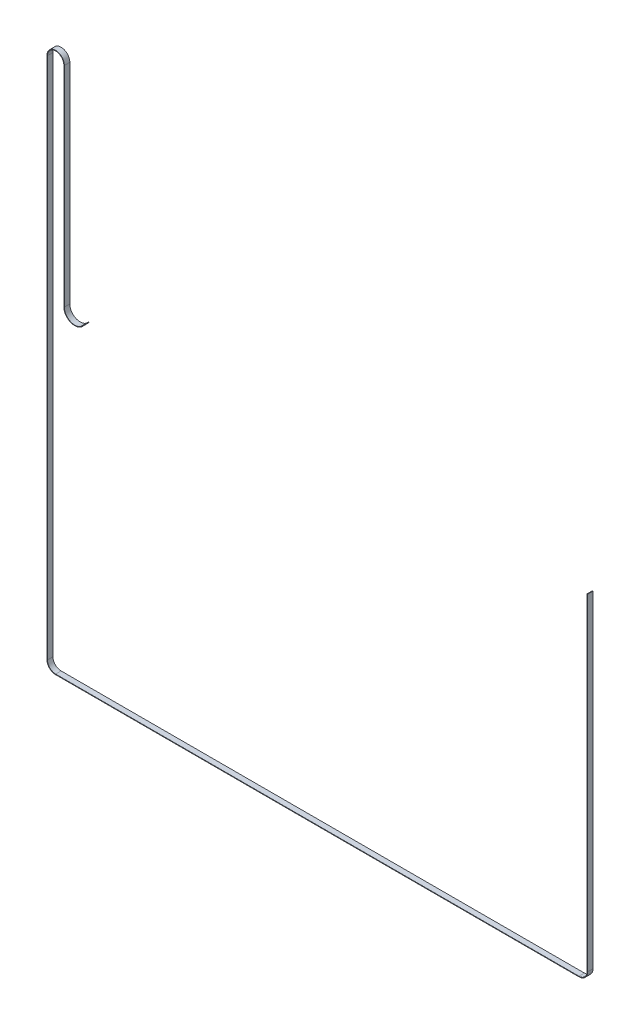
ISO-10303-21;
HEADER;
FILE_DESCRIPTION(('STEP AP214'),'2;1');
FILE_NAME('part.step','',(''),(''),'','','');
FILE_SCHEMA(('AUTOMOTIVE_DESIGN { 1 0 10303 214 1 1 1 1 }'));
ENDSEC;
DATA;
#1=APPLICATION_CONTEXT('core data for automotive mechanical design processes');
#2=APPLICATION_PROTOCOL_DEFINITION('international standard','automotive_design',2000,#1);
#3=PRODUCT_CONTEXT('',#1,'mechanical');
#4=PRODUCT('Part','Part','',(#3));
#5=PRODUCT_RELATED_PRODUCT_CATEGORY('part','',(#4));
#6=PRODUCT_DEFINITION_FORMATION('','',#4);
#7=PRODUCT_DEFINITION_CONTEXT('part definition',#1,'design');
#8=PRODUCT_DEFINITION('design','',#6,#7);
#9=PRODUCT_DEFINITION_SHAPE('','',#8);
#10=(LENGTH_UNIT() NAMED_UNIT(*) SI_UNIT(.MILLI.,.METRE.));
#11=(NAMED_UNIT(*) PLANE_ANGLE_UNIT() SI_UNIT($,.RADIAN.));
#12=(NAMED_UNIT(*) SI_UNIT($,.STERADIAN.) SOLID_ANGLE_UNIT());
#13=UNCERTAINTY_MEASURE_WITH_UNIT(LENGTH_MEASURE(1.E-05),#10,'distance_accuracy_value','');
#14=(GEOMETRIC_REPRESENTATION_CONTEXT(3) GLOBAL_UNCERTAINTY_ASSIGNED_CONTEXT((#13)) GLOBAL_UNIT_ASSIGNED_CONTEXT((#10,
#11,#12)) REPRESENTATION_CONTEXT('',''));
#15=CARTESIAN_POINT('',(0.,0.,0.));
#16=DIRECTION('',(0.,0.,1.));
#17=DIRECTION('',(1.,0.,0.));
#18=AXIS2_PLACEMENT_3D('',#15,#16,#17);
#19=CARTESIAN_POINT('',(-222.5,288.,2.5));
#20=DIRECTION('',(0.,0.,-1.));
#21=DIRECTION('',(-1.,0.,0.));
#22=AXIS2_PLACEMENT_3D('',#19,#20,#21);
#23=CYLINDRICAL_SURFACE('',#22,9.99999999999962);
#24=CARTESIAN_POINT('',(-222.5,288.,-2.5));
#25=DIRECTION('',(0.,0.,1.));
#26=DIRECTION('',(1.,0.,0.));
#27=AXIS2_PLACEMENT_3D('',#24,#25,#26);
#28=CIRCLE('',#27,9.99999999999962);
#29=CARTESIAN_POINT('',(-232.5,288.,-2.5));
#30=VERTEX_POINT('',#29);
#31=CARTESIAN_POINT('',(-214.437599566757,282.084114668621,-2.5));
#32=VERTEX_POINT('',#31);
#33=EDGE_CURVE('E188',#30,#32,#28,.T.);
#34=ORIENTED_EDGE('',*,*,#33,.T.);
#35=DIRECTION('',(0.,0.,-1.));
#36=VECTOR('',#35,1.);
#37=CARTESIAN_POINT('',(-214.437599566757,282.084114668621,2.5));
#38=LINE('',#37,#36);
#39=CARTESIAN_POINT('',(-214.437599566757,282.084114668621,2.5));
#40=VERTEX_POINT('',#39);
#41=EDGE_CURVE('E11',#40,#32,#38,.T.);
#42=ORIENTED_EDGE('',*,*,#41,.F.);
#43=CARTESIAN_POINT('',(-222.5,288.,2.5));
#44=DIRECTION('',(0.,0.,1.));
#45=DIRECTION('',(1.,0.,0.));
#46=AXIS2_PLACEMENT_3D('',#43,#44,#45);
#47=CIRCLE('',#46,9.99999999999962);
#48=CARTESIAN_POINT('',(-232.5,288.,2.5));
#49=VERTEX_POINT('',#48);
#50=EDGE_CURVE('E119',#49,#40,#47,.T.);
#51=ORIENTED_EDGE('',*,*,#50,.F.);
#52=DIRECTION('',(0.,0.,-1.));
#53=VECTOR('',#52,1.);
#54=CARTESIAN_POINT('',(-232.5,288.,2.5));
#55=LINE('',#54,#53);
#56=EDGE_CURVE('E184',#49,#30,#55,.T.);
#57=ORIENTED_EDGE('',*,*,#56,.T.);
#58=EDGE_LOOP('',(#34,#42,#51,#57));
#59=FACE_BOUND('',#58,.T.);
#60=ADVANCED_FACE('F33',(#59),#23,.T.);
#61=CARTESIAN_POINT('',(-214.840719588419,282.37990893519,2.5));
#62=DIRECTION('',(0.591588533137898,0.806240043324412,0.));
#63=DIRECTION('',(-0.806240043324412,0.591588533137898,0.));
#64=AXIS2_PLACEMENT_3D('',#61,#62,#63);
#65=PLANE('',#64);
#66=DIRECTION('',(0.806240043324412,-0.591588533137898,0.));
#67=VECTOR('',#66,1.);
#68=CARTESIAN_POINT('',(-214.840719588419,282.37990893519,-2.5));
#69=LINE('',#68,#67);
#70=CARTESIAN_POINT('',(-214.840719588419,282.37990893519,-2.5));
#71=VERTEX_POINT('',#70);
#72=EDGE_CURVE('E191',#71,#32,#69,.T.);
#73=ORIENTED_EDGE('',*,*,#72,.F.);
#74=DIRECTION('',(0.,0.,-1.));
#75=VECTOR('',#74,1.);
#76=CARTESIAN_POINT('',(-214.840719588419,282.37990893519,2.5));
#77=LINE('',#76,#75);
#78=CARTESIAN_POINT('',(-214.840719588419,282.37990893519,2.5));
#79=VERTEX_POINT('',#78);
#80=EDGE_CURVE('E41',#79,#71,#77,.T.);
#81=ORIENTED_EDGE('',*,*,#80,.F.);
#82=DIRECTION('',(0.806240043324412,-0.591588533137898,0.));
#83=VECTOR('',#82,1.);
#84=CARTESIAN_POINT('',(-214.840719588419,282.37990893519,2.5));
#85=LINE('',#84,#83);
#86=EDGE_CURVE('E283',#79,#40,#85,.T.);
#87=ORIENTED_EDGE('',*,*,#86,.T.);
#88=ORIENTED_EDGE('',*,*,#41,.T.);
#89=EDGE_LOOP('',(#73,#81,#87,#88));
#90=FACE_BOUND('',#89,.T.);
#91=ADVANCED_FACE('F270',(#90),#65,.T.);
#92=CARTESIAN_POINT('',(-222.5,288.,2.5));
#93=DIRECTION('',(0.,0.,-1.));
#94=DIRECTION('',(-1.,0.,0.));
#95=AXIS2_PLACEMENT_3D('',#92,#93,#94);
#96=CYLINDRICAL_SURFACE('',#95,9.49999999999962);
#97=CARTESIAN_POINT('',(-222.5,288.,-2.5));
#98=DIRECTION('',(0.,0.,1.));
#99=DIRECTION('',(1.,0.,0.));
#100=AXIS2_PLACEMENT_3D('',#97,#98,#99);
#101=CIRCLE('',#100,9.49999999999962);
#102=CARTESIAN_POINT('',(-232.,288.,-2.5));
#103=VERTEX_POINT('',#102);
#104=EDGE_CURVE('E194',#103,#71,#101,.T.);
#105=ORIENTED_EDGE('',*,*,#104,.F.);
#106=DIRECTION('',(0.,0.,-1.));
#107=VECTOR('',#106,1.);
#108=CARTESIAN_POINT('',(-232.,288.,2.5));
#109=LINE('',#108,#107);
#110=CARTESIAN_POINT('',(-232.,288.,2.5));
#111=VERTEX_POINT('',#110);
#112=EDGE_CURVE('E260',#111,#103,#109,.T.);
#113=ORIENTED_EDGE('',*,*,#112,.F.);
#114=CARTESIAN_POINT('',(-222.5,288.,2.5));
#115=DIRECTION('',(0.,0.,1.));
#116=DIRECTION('',(1.,0.,0.));
#117=AXIS2_PLACEMENT_3D('',#114,#115,#116);
#118=CIRCLE('',#117,9.49999999999962);
#119=EDGE_CURVE('E267',#111,#79,#118,.T.);
#120=ORIENTED_EDGE('',*,*,#119,.T.);
#121=ORIENTED_EDGE('',*,*,#80,.T.);
#122=EDGE_LOOP('',(#105,#113,#120,#121));
#123=FACE_BOUND('',#122,.T.);
#124=ADVANCED_FACE('F265',(#123),#96,.F.);
#125=CARTESIAN_POINT('',(-232.,480.,2.5));
#126=DIRECTION('',(1.,0.,0.));
#127=DIRECTION('',(0.,1.,0.));
#128=AXIS2_PLACEMENT_3D('',#125,#126,#127);
#129=PLANE('',#128);
#130=DIRECTION('',(0.,-1.,0.));
#131=VECTOR('',#130,1.);
#132=CARTESIAN_POINT('',(-232.,480.,-2.5));
#133=LINE('',#132,#131);
#134=CARTESIAN_POINT('',(-232.,480.,-2.5));
#135=VERTEX_POINT('',#134);
#136=EDGE_CURVE('E197',#135,#103,#133,.T.);
#137=ORIENTED_EDGE('',*,*,#136,.F.);
#138=DIRECTION('',(0.,0.,-1.));
#139=VECTOR('',#138,1.);
#140=CARTESIAN_POINT('',(-232.,480.,2.5));
#141=LINE('',#140,#139);
#142=CARTESIAN_POINT('',(-232.,480.,2.5));
#143=VERTEX_POINT('',#142);
#144=EDGE_CURVE('E258',#143,#135,#141,.T.);
#145=ORIENTED_EDGE('',*,*,#144,.F.);
#146=DIRECTION('',(0.,-1.,0.));
#147=VECTOR('',#146,1.);
#148=CARTESIAN_POINT('',(-232.,480.,2.5));
#149=LINE('',#148,#147);
#150=EDGE_CURVE('E280',#143,#111,#149,.T.);
#151=ORIENTED_EDGE('',*,*,#150,.T.);
#152=ORIENTED_EDGE('',*,*,#112,.T.);
#153=EDGE_LOOP('',(#137,#145,#151,#152));
#154=FACE_BOUND('',#153,.T.);
#155=ADVANCED_FACE('F277',(#154),#129,.T.);
#156=CARTESIAN_POINT('',(-240.,480.,2.5));
#157=DIRECTION('',(0.,0.,-1.));
#158=DIRECTION('',(-1.,0.,0.));
#159=AXIS2_PLACEMENT_3D('',#156,#157,#158);
#160=CYLINDRICAL_SURFACE('',#159,8.00000000000001);
#161=CARTESIAN_POINT('',(-240.,480.,-2.5));
#162=DIRECTION('',(0.,0.,1.));
#163=DIRECTION('',(1.,0.,0.));
#164=AXIS2_PLACEMENT_3D('',#161,#162,#163);
#165=CIRCLE('',#164,8.00000000000001);
#166=CARTESIAN_POINT('',(-248.,480.,-2.5));
#167=VERTEX_POINT('',#166);
#168=EDGE_CURVE('E200',#167,#135,#165,.F.);
#169=ORIENTED_EDGE('',*,*,#168,.F.);
#170=DIRECTION('',(0.,0.,-1.));
#171=VECTOR('',#170,1.);
#172=CARTESIAN_POINT('',(-248.,480.,2.5));
#173=LINE('',#172,#171);
#174=CARTESIAN_POINT('',(-248.,480.,2.5));
#175=VERTEX_POINT('',#174);
#176=EDGE_CURVE('E256',#175,#167,#173,.T.);
#177=ORIENTED_EDGE('',*,*,#176,.F.);
#178=CARTESIAN_POINT('',(-240.,480.,2.5));
#179=DIRECTION('',(0.,0.,1.));
#180=DIRECTION('',(1.,0.,0.));
#181=AXIS2_PLACEMENT_3D('',#178,#179,#180);
#182=CIRCLE('',#181,8.00000000000001);
#183=EDGE_CURVE('E285',#175,#143,#182,.F.);
#184=ORIENTED_EDGE('',*,*,#183,.T.);
#185=ORIENTED_EDGE('',*,*,#144,.T.);
#186=EDGE_LOOP('',(#169,#177,#184,#185));
#187=FACE_BOUND('',#186,.T.);
#188=ADVANCED_FACE('F346',(#187),#160,.T.);
#189=CARTESIAN_POINT('',(-248.,0.,2.5));
#190=DIRECTION('',(-1.,0.,0.));
#191=DIRECTION('',(0.,0.,1.));
#192=AXIS2_PLACEMENT_3D('',#189,#190,#191);
#193=PLANE('',#192);
#194=DIRECTION('',(0.,1.,0.));
#195=VECTOR('',#194,1.);
#196=CARTESIAN_POINT('',(-248.,0.,-2.5));
#197=LINE('',#196,#195);
#198=CARTESIAN_POINT('',(-248.,0.,-2.5));
#199=VERTEX_POINT('',#198);
#200=EDGE_CURVE('E203',#199,#167,#197,.T.);
#201=ORIENTED_EDGE('',*,*,#200,.F.);
#202=DIRECTION('',(0.,0.,-1.));
#203=VECTOR('',#202,1.);
#204=CARTESIAN_POINT('',(-248.,0.,2.5));
#205=LINE('',#204,#203);
#206=CARTESIAN_POINT('',(-248.,0.,2.5));
#207=VERTEX_POINT('',#206);
#208=EDGE_CURVE('E254',#207,#199,#205,.T.);
#209=ORIENTED_EDGE('',*,*,#208,.F.);
#210=DIRECTION('',(0.,1.,0.));
#211=VECTOR('',#210,1.);
#212=CARTESIAN_POINT('',(-248.,0.,2.5));
#213=LINE('',#212,#211);
#214=EDGE_CURVE('E291',#207,#175,#213,.T.);
#215=ORIENTED_EDGE('',*,*,#214,.T.);
#216=ORIENTED_EDGE('',*,*,#176,.T.);
#217=EDGE_LOOP('',(#201,#209,#215,#216));
#218=FACE_BOUND('',#217,.T.);
#219=ADVANCED_FACE('F349',(#218),#193,.T.);
#220=CARTESIAN_POINT('',(-240.,0.,2.5));
#221=DIRECTION('',(0.,0.,-1.));
#222=DIRECTION('',(-1.,0.,0.));
#223=AXIS2_PLACEMENT_3D('',#220,#221,#222);
#224=CYLINDRICAL_SURFACE('',#223,8.);
#225=CARTESIAN_POINT('',(-240.,0.,-2.5));
#226=DIRECTION('',(0.,0.,1.));
#227=DIRECTION('',(1.,0.,0.));
#228=AXIS2_PLACEMENT_3D('',#225,#226,#227);
#229=CIRCLE('',#228,8.);
#230=CARTESIAN_POINT('',(-240.,-8.00000000000002,-2.5));
#231=VERTEX_POINT('',#230);
#232=EDGE_CURVE('E206',#231,#199,#229,.F.);
#233=ORIENTED_EDGE('',*,*,#232,.F.);
#234=DIRECTION('',(0.,0.,-1.));
#235=VECTOR('',#234,1.);
#236=CARTESIAN_POINT('',(-240.,-8.00000000000002,2.5));
#237=LINE('',#236,#235);
#238=CARTESIAN_POINT('',(-240.,-8.00000000000002,2.5));
#239=VERTEX_POINT('',#238);
#240=EDGE_CURVE('E252',#239,#231,#237,.T.);
#241=ORIENTED_EDGE('',*,*,#240,.F.);
#242=CARTESIAN_POINT('',(-240.,0.,2.5));
#243=DIRECTION('',(0.,0.,1.));
#244=DIRECTION('',(1.,0.,0.));
#245=AXIS2_PLACEMENT_3D('',#242,#243,#244);
#246=CIRCLE('',#245,8.);
#247=EDGE_CURVE('E294',#239,#207,#246,.F.);
#248=ORIENTED_EDGE('',*,*,#247,.T.);
#249=ORIENTED_EDGE('',*,*,#208,.T.);
#250=EDGE_LOOP('',(#233,#241,#248,#249));
#251=FACE_BOUND('',#250,.T.);
#252=ADVANCED_FACE('F353',(#251),#224,.T.);
#253=CARTESIAN_POINT('',(240.,-8.00000000000001,2.5));
#254=DIRECTION('',(0.,-1.,0.));
#255=DIRECTION('',(0.,0.,-1.));
#256=AXIS2_PLACEMENT_3D('',#253,#254,#255);
#257=PLANE('',#256);
#258=DIRECTION('',(1.,0.,0.));
#259=VECTOR('',#258,1.);
#260=CARTESIAN_POINT('',(240.,-8.00000000000001,-2.5));
#261=LINE('',#260,#259);
#262=CARTESIAN_POINT('',(240.,-8.00000000000001,-2.5));
#263=VERTEX_POINT('',#262);
#264=EDGE_CURVE('E209',#263,#231,#261,.F.);
#265=ORIENTED_EDGE('',*,*,#264,.F.);
#266=DIRECTION('',(0.,0.,-1.));
#267=VECTOR('',#266,1.);
#268=CARTESIAN_POINT('',(240.,-8.00000000000001,2.5));
#269=LINE('',#268,#267);
#270=CARTESIAN_POINT('',(240.,-8.00000000000001,2.5));
#271=VERTEX_POINT('',#270);
#272=EDGE_CURVE('E250',#271,#263,#269,.T.);
#273=ORIENTED_EDGE('',*,*,#272,.F.);
#274=DIRECTION('',(1.,0.,0.));
#275=VECTOR('',#274,1.);
#276=CARTESIAN_POINT('',(240.,-8.00000000000001,2.5));
#277=LINE('',#276,#275);
#278=EDGE_CURVE('E297',#271,#239,#277,.F.);
#279=ORIENTED_EDGE('',*,*,#278,.T.);
#280=ORIENTED_EDGE('',*,*,#240,.T.);
#281=EDGE_LOOP('',(#265,#273,#279,#280));
#282=FACE_BOUND('',#281,.T.);
#283=ADVANCED_FACE('F357',(#282),#257,.T.);
#284=CARTESIAN_POINT('',(240.,0.,2.5));
#285=DIRECTION('',(0.,0.,-1.));
#286=DIRECTION('',(-1.,0.,0.));
#287=AXIS2_PLACEMENT_3D('',#284,#285,#286);
#288=CYLINDRICAL_SURFACE('',#287,8.00000000000004);
#289=CARTESIAN_POINT('',(240.,0.,-2.5));
#290=DIRECTION('',(0.,0.,1.));
#291=DIRECTION('',(1.,0.,0.));
#292=AXIS2_PLACEMENT_3D('',#289,#290,#291);
#293=CIRCLE('',#292,8.00000000000004);
#294=CARTESIAN_POINT('',(248.,0.,-2.5));
#295=VERTEX_POINT('',#294);
#296=EDGE_CURVE('E212',#295,#263,#293,.F.);
#297=ORIENTED_EDGE('',*,*,#296,.F.);
#298=DIRECTION('',(0.,0.,-1.));
#299=VECTOR('',#298,1.);
#300=CARTESIAN_POINT('',(248.,0.,2.5));
#301=LINE('',#300,#299);
#302=CARTESIAN_POINT('',(248.,0.,2.5));
#303=VERTEX_POINT('',#302);
#304=EDGE_CURVE('E248',#303,#295,#301,.T.);
#305=ORIENTED_EDGE('',*,*,#304,.F.);
#306=CARTESIAN_POINT('',(240.,0.,2.5));
#307=DIRECTION('',(0.,0.,1.));
#308=DIRECTION('',(1.,0.,0.));
#309=AXIS2_PLACEMENT_3D('',#306,#307,#308);
#310=CIRCLE('',#309,8.00000000000004);
#311=EDGE_CURVE('E300',#303,#271,#310,.F.);
#312=ORIENTED_EDGE('',*,*,#311,.T.);
#313=ORIENTED_EDGE('',*,*,#272,.T.);
#314=EDGE_LOOP('',(#297,#305,#312,#313));
#315=FACE_BOUND('',#314,.T.);
#316=ADVANCED_FACE('F361',(#315),#288,.T.);
#317=CARTESIAN_POINT('',(248.,0.,2.5));
#318=DIRECTION('',(1.,0.,0.));
#319=DIRECTION('',(0.,0.,-1.));
#320=AXIS2_PLACEMENT_3D('',#317,#318,#319);
#321=PLANE('',#320);
#322=DIRECTION('',(0.,1.,0.));
#323=VECTOR('',#322,1.);
#324=CARTESIAN_POINT('',(248.,0.,-2.5));
#325=LINE('',#324,#323);
#326=CARTESIAN_POINT('',(248.,300.,-2.5));
#327=VERTEX_POINT('',#326);
#328=EDGE_CURVE('E215',#327,#295,#325,.F.);
#329=ORIENTED_EDGE('',*,*,#328,.F.);
#330=DIRECTION('',(0.,0.,-1.));
#331=VECTOR('',#330,1.);
#332=CARTESIAN_POINT('',(248.,300.,2.5));
#333=LINE('',#332,#331);
#334=CARTESIAN_POINT('',(248.,300.,2.5));
#335=VERTEX_POINT('',#334);
#336=EDGE_CURVE('E246',#335,#327,#333,.T.);
#337=ORIENTED_EDGE('',*,*,#336,.F.);
#338=DIRECTION('',(0.,1.,0.));
#339=VECTOR('',#338,1.);
#340=CARTESIAN_POINT('',(248.,0.,2.5));
#341=LINE('',#340,#339);
#342=EDGE_CURVE('E303',#335,#303,#341,.F.);
#343=ORIENTED_EDGE('',*,*,#342,.T.);
#344=ORIENTED_EDGE('',*,*,#304,.T.);
#345=EDGE_LOOP('',(#329,#337,#343,#344));
#346=FACE_BOUND('',#345,.T.);
#347=ADVANCED_FACE('F365',(#346),#321,.T.);
#348=CARTESIAN_POINT('',(247.5,300.,2.5));
#349=DIRECTION('',(0.,1.,0.));
#350=DIRECTION('',(0.,0.,1.));
#351=AXIS2_PLACEMENT_3D('',#348,#349,#350);
#352=PLANE('',#351);
#353=DIRECTION('',(1.,0.,0.));
#354=VECTOR('',#353,1.);
#355=CARTESIAN_POINT('',(247.5,300.,-2.5));
#356=LINE('',#355,#354);
#357=CARTESIAN_POINT('',(247.5,300.,-2.5));
#358=VERTEX_POINT('',#357);
#359=EDGE_CURVE('E218',#358,#327,#356,.T.);
#360=ORIENTED_EDGE('',*,*,#359,.F.);
#361=DIRECTION('',(0.,0.,-1.));
#362=VECTOR('',#361,1.);
#363=CARTESIAN_POINT('',(247.5,300.,2.5));
#364=LINE('',#363,#362);
#365=CARTESIAN_POINT('',(247.5,300.,2.5));
#366=VERTEX_POINT('',#365);
#367=EDGE_CURVE('E244',#366,#358,#364,.T.);
#368=ORIENTED_EDGE('',*,*,#367,.F.);
#369=DIRECTION('',(1.,0.,0.));
#370=VECTOR('',#369,1.);
#371=CARTESIAN_POINT('',(247.5,300.,2.5));
#372=LINE('',#371,#370);
#373=EDGE_CURVE('E306',#366,#335,#372,.T.);
#374=ORIENTED_EDGE('',*,*,#373,.T.);
#375=ORIENTED_EDGE('',*,*,#336,.T.);
#376=EDGE_LOOP('',(#360,#368,#374,#375));
#377=FACE_BOUND('',#376,.T.);
#378=ADVANCED_FACE('F369',(#377),#352,.T.);
#379=CARTESIAN_POINT('',(247.5,0.,2.5));
#380=DIRECTION('',(1.,0.,0.));
#381=DIRECTION('',(0.,0.,-1.));
#382=AXIS2_PLACEMENT_3D('',#379,#380,#381);
#383=PLANE('',#382);
#384=DIRECTION('',(0.,-1.,0.));
#385=VECTOR('',#384,1.);
#386=CARTESIAN_POINT('',(247.5,0.,-2.5));
#387=LINE('',#386,#385);
#388=CARTESIAN_POINT('',(247.5,0.,-2.5));
#389=VERTEX_POINT('',#388);
#390=EDGE_CURVE('E221',#358,#389,#387,.T.);
#391=ORIENTED_EDGE('',*,*,#390,.T.);
#392=DIRECTION('',(0.,0.,-1.));
#393=VECTOR('',#392,1.);
#394=CARTESIAN_POINT('',(247.5,0.,2.5));
#395=LINE('',#394,#393);
#396=CARTESIAN_POINT('',(247.5,0.,2.5));
#397=VERTEX_POINT('',#396);
#398=EDGE_CURVE('E241',#397,#389,#395,.T.);
#399=ORIENTED_EDGE('',*,*,#398,.F.);
#400=DIRECTION('',(0.,-1.,0.));
#401=VECTOR('',#400,1.);
#402=CARTESIAN_POINT('',(247.5,0.,2.5));
#403=LINE('',#402,#401);
#404=EDGE_CURVE('E309',#366,#397,#403,.T.);
#405=ORIENTED_EDGE('',*,*,#404,.F.);
#406=ORIENTED_EDGE('',*,*,#367,.T.);
#407=EDGE_LOOP('',(#391,#399,#405,#406));
#408=FACE_BOUND('',#407,.T.);
#409=ADVANCED_FACE('F373',(#408),#383,.F.);
#410=CARTESIAN_POINT('',(240.,0.,2.5));
#411=DIRECTION('',(0.,0.,-1.));
#412=DIRECTION('',(-1.,0.,0.));
#413=AXIS2_PLACEMENT_3D('',#410,#411,#412);
#414=CYLINDRICAL_SURFACE('',#413,7.50000000000004);
#415=CARTESIAN_POINT('',(240.,0.,-2.5));
#416=DIRECTION('',(0.,0.,-1.));
#417=DIRECTION('',(-1.,0.,0.));
#418=AXIS2_PLACEMENT_3D('',#415,#416,#417);
#419=CIRCLE('',#418,7.50000000000004);
#420=CARTESIAN_POINT('',(240.,-7.50000000000001,-2.5));
#421=VERTEX_POINT('',#420);
#422=EDGE_CURVE('E223',#389,#421,#419,.T.);
#423=ORIENTED_EDGE('',*,*,#422,.T.);
#424=DIRECTION('',(0.,0.,-1.));
#425=VECTOR('',#424,1.);
#426=CARTESIAN_POINT('',(240.,-7.50000000000001,2.5));
#427=LINE('',#426,#425);
#428=CARTESIAN_POINT('',(240.,-7.50000000000001,2.5));
#429=VERTEX_POINT('',#428);
#430=EDGE_CURVE('E238',#429,#421,#427,.T.);
#431=ORIENTED_EDGE('',*,*,#430,.F.);
#432=CARTESIAN_POINT('',(240.,0.,2.5));
#433=DIRECTION('',(0.,0.,-1.));
#434=DIRECTION('',(-1.,0.,0.));
#435=AXIS2_PLACEMENT_3D('',#432,#433,#434);
#436=CIRCLE('',#435,7.50000000000004);
#437=EDGE_CURVE('E311',#397,#429,#436,.T.);
#438=ORIENTED_EDGE('',*,*,#437,.F.);
#439=ORIENTED_EDGE('',*,*,#398,.T.);
#440=EDGE_LOOP('',(#423,#431,#438,#439));
#441=FACE_BOUND('',#440,.T.);
#442=ADVANCED_FACE('F377',(#441),#414,.F.);
#443=CARTESIAN_POINT('',(240.,-7.50000000000001,2.5));
#444=DIRECTION('',(0.,-1.,0.));
#445=DIRECTION('',(0.,0.,-1.));
#446=AXIS2_PLACEMENT_3D('',#443,#444,#445);
#447=PLANE('',#446);
#448=DIRECTION('',(-1.,0.,0.));
#449=VECTOR('',#448,1.);
#450=CARTESIAN_POINT('',(240.,-7.50000000000001,-2.5));
#451=LINE('',#450,#449);
#452=CARTESIAN_POINT('',(-240.,-7.50000000000001,-2.5));
#453=VERTEX_POINT('',#452);
#454=EDGE_CURVE('E225',#421,#453,#451,.T.);
#455=ORIENTED_EDGE('',*,*,#454,.T.);
#456=DIRECTION('',(0.,0.,-1.));
#457=VECTOR('',#456,1.);
#458=CARTESIAN_POINT('',(-240.,-7.50000000000001,2.5));
#459=LINE('',#458,#457);
#460=CARTESIAN_POINT('',(-240.,-7.50000000000001,2.5));
#461=VERTEX_POINT('',#460);
#462=EDGE_CURVE('E235',#461,#453,#459,.T.);
#463=ORIENTED_EDGE('',*,*,#462,.F.);
#464=DIRECTION('',(-1.,0.,0.));
#465=VECTOR('',#464,1.);
#466=CARTESIAN_POINT('',(240.,-7.50000000000001,2.5));
#467=LINE('',#466,#465);
#468=EDGE_CURVE('E313',#429,#461,#467,.T.);
#469=ORIENTED_EDGE('',*,*,#468,.F.);
#470=ORIENTED_EDGE('',*,*,#430,.T.);
#471=EDGE_LOOP('',(#455,#463,#469,#470));
#472=FACE_BOUND('',#471,.T.);
#473=ADVANCED_FACE('F319',(#472),#447,.F.);
#474=CARTESIAN_POINT('',(-240.,0.,2.5));
#475=DIRECTION('',(0.,0.,-1.));
#476=DIRECTION('',(-1.,0.,0.));
#477=AXIS2_PLACEMENT_3D('',#474,#475,#476);
#478=CYLINDRICAL_SURFACE('',#477,7.5);
#479=CARTESIAN_POINT('',(-240.,0.,-2.5));
#480=DIRECTION('',(0.,0.,-1.));
#481=DIRECTION('',(1.,0.,0.));
#482=AXIS2_PLACEMENT_3D('',#479,#480,#481);
#483=CIRCLE('',#482,7.5);
#484=CARTESIAN_POINT('',(-247.5,0.,-2.5));
#485=VERTEX_POINT('',#484);
#486=EDGE_CURVE('E227',#453,#485,#483,.T.);
#487=ORIENTED_EDGE('',*,*,#486,.T.);
#488=DIRECTION('',(0.,0.,-1.));
#489=VECTOR('',#488,1.);
#490=CARTESIAN_POINT('',(-247.5,0.,2.5));
#491=LINE('',#490,#489);
#492=CARTESIAN_POINT('',(-247.5,0.,2.5));
#493=VERTEX_POINT('',#492);
#494=EDGE_CURVE('E179',#493,#485,#491,.T.);
#495=ORIENTED_EDGE('',*,*,#494,.F.);
#496=CARTESIAN_POINT('',(-240.,0.,2.5));
#497=DIRECTION('',(0.,0.,-1.));
#498=DIRECTION('',(1.,0.,0.));
#499=AXIS2_PLACEMENT_3D('',#496,#497,#498);
#500=CIRCLE('',#499,7.5);
#501=EDGE_CURVE('E170',#461,#493,#500,.T.);
#502=ORIENTED_EDGE('',*,*,#501,.F.);
#503=ORIENTED_EDGE('',*,*,#462,.T.);
#504=EDGE_LOOP('',(#487,#495,#502,#503));
#505=FACE_BOUND('',#504,.T.);
#506=ADVANCED_FACE('F323',(#505),#478,.F.);
#507=CARTESIAN_POINT('',(-247.5,0.,2.5));
#508=DIRECTION('',(-1.,0.,0.));
#509=DIRECTION('',(0.,0.,1.));
#510=AXIS2_PLACEMENT_3D('',#507,#508,#509);
#511=PLANE('',#510);
#512=DIRECTION('',(0.,1.,0.));
#513=VECTOR('',#512,1.);
#514=CARTESIAN_POINT('',(-247.5,0.,-2.5));
#515=LINE('',#514,#513);
#516=CARTESIAN_POINT('',(-247.5,480.,-2.5));
#517=VERTEX_POINT('',#516);
#518=EDGE_CURVE('E178',#485,#517,#515,.T.);
#519=ORIENTED_EDGE('',*,*,#518,.T.);
#520=DIRECTION('',(0.,0.,-1.));
#521=VECTOR('',#520,1.);
#522=CARTESIAN_POINT('',(-247.5,480.,2.5));
#523=LINE('',#522,#521);
#524=CARTESIAN_POINT('',(-247.5,480.,2.5));
#525=VERTEX_POINT('',#524);
#526=EDGE_CURVE('E175',#525,#517,#523,.T.);
#527=ORIENTED_EDGE('',*,*,#526,.F.);
#528=DIRECTION('',(0.,1.,0.));
#529=VECTOR('',#528,1.);
#530=CARTESIAN_POINT('',(-247.5,0.,2.5));
#531=LINE('',#530,#529);
#532=EDGE_CURVE('E164',#493,#525,#531,.T.);
#533=ORIENTED_EDGE('',*,*,#532,.F.);
#534=ORIENTED_EDGE('',*,*,#494,.T.);
#535=EDGE_LOOP('',(#519,#527,#533,#534));
#536=FACE_BOUND('',#535,.T.);
#537=ADVANCED_FACE('F176',(#536),#511,.F.);
#538=CARTESIAN_POINT('',(-240.,480.,2.5));
#539=DIRECTION('',(0.,0.,-1.));
#540=DIRECTION('',(-1.,0.,0.));
#541=AXIS2_PLACEMENT_3D('',#538,#539,#540);
#542=CYLINDRICAL_SURFACE('',#541,7.50000000000001);
#543=CARTESIAN_POINT('',(-240.,480.,-2.5));
#544=DIRECTION('',(0.,0.,-1.));
#545=DIRECTION('',(1.,0.,0.));
#546=AXIS2_PLACEMENT_3D('',#543,#544,#545);
#547=CIRCLE('',#546,7.50000000000001);
#548=CARTESIAN_POINT('',(-232.5,480.,-2.5));
#549=VERTEX_POINT('',#548);
#550=EDGE_CURVE('E107',#517,#549,#547,.T.);
#551=ORIENTED_EDGE('',*,*,#550,.T.);
#552=DIRECTION('',(0.,0.,-1.));
#553=VECTOR('',#552,1.);
#554=CARTESIAN_POINT('',(-232.5,480.,2.5));
#555=LINE('',#554,#553);
#556=CARTESIAN_POINT('',(-232.5,480.,2.5));
#557=VERTEX_POINT('',#556);
#558=EDGE_CURVE('E180',#557,#549,#555,.T.);
#559=ORIENTED_EDGE('',*,*,#558,.F.);
#560=CARTESIAN_POINT('',(-240.,480.,2.5));
#561=DIRECTION('',(0.,0.,-1.));
#562=DIRECTION('',(1.,0.,0.));
#563=AXIS2_PLACEMENT_3D('',#560,#561,#562);
#564=CIRCLE('',#563,7.50000000000001);
#565=EDGE_CURVE('E168',#525,#557,#564,.T.);
#566=ORIENTED_EDGE('',*,*,#565,.F.);
#567=ORIENTED_EDGE('',*,*,#526,.T.);
#568=EDGE_LOOP('',(#551,#559,#566,#567));
#569=FACE_BOUND('',#568,.T.);
#570=ADVANCED_FACE('F182',(#569),#542,.F.);
#571=CARTESIAN_POINT('',(-232.5,480.,2.5));
#572=DIRECTION('',(1.,0.,0.));
#573=DIRECTION('',(0.,1.,0.));
#574=AXIS2_PLACEMENT_3D('',#571,#572,#573);
#575=PLANE('',#574);
#576=DIRECTION('',(0.,-1.,0.));
#577=VECTOR('',#576,1.);
#578=CARTESIAN_POINT('',(-232.5,480.,-2.5));
#579=LINE('',#578,#577);
#580=EDGE_CURVE('E113',#549,#30,#579,.T.);
#581=ORIENTED_EDGE('',*,*,#580,.T.);
#582=ORIENTED_EDGE('',*,*,#56,.F.);
#583=DIRECTION('',(0.,-1.,0.));
#584=VECTOR('',#583,1.);
#585=CARTESIAN_POINT('',(-232.5,480.,2.5));
#586=LINE('',#585,#584);
#587=EDGE_CURVE('E49',#557,#49,#586,.T.);
#588=ORIENTED_EDGE('',*,*,#587,.F.);
#589=ORIENTED_EDGE('',*,*,#558,.T.);
#590=EDGE_LOOP('',(#581,#582,#588,#589));
#591=FACE_BOUND('',#590,.T.);
#592=ADVANCED_FACE('F325',(#591),#575,.F.);
#593=CARTESIAN_POINT('',(-222.5,288.,2.5));
#594=DIRECTION('',(0.,0.,1.));
#595=DIRECTION('',(1.,0.,0.));
#596=AXIS2_PLACEMENT_3D('',#593,#594,#595);
#597=PLANE('',#596);
#598=ORIENTED_EDGE('',*,*,#50,.T.);
#599=ORIENTED_EDGE('',*,*,#86,.F.);
#600=ORIENTED_EDGE('',*,*,#119,.F.);
#601=ORIENTED_EDGE('',*,*,#150,.F.);
#602=ORIENTED_EDGE('',*,*,#183,.F.);
#603=ORIENTED_EDGE('',*,*,#214,.F.);
#604=ORIENTED_EDGE('',*,*,#247,.F.);
#605=ORIENTED_EDGE('',*,*,#278,.F.);
#606=ORIENTED_EDGE('',*,*,#311,.F.);
#607=ORIENTED_EDGE('',*,*,#342,.F.);
#608=ORIENTED_EDGE('',*,*,#373,.F.);
#609=ORIENTED_EDGE('',*,*,#404,.T.);
#610=ORIENTED_EDGE('',*,*,#437,.T.);
#611=ORIENTED_EDGE('',*,*,#468,.T.);
#612=ORIENTED_EDGE('',*,*,#501,.T.);
#613=ORIENTED_EDGE('',*,*,#532,.T.);
#614=ORIENTED_EDGE('',*,*,#565,.T.);
#615=ORIENTED_EDGE('',*,*,#587,.T.);
#616=EDGE_LOOP('',(#598,#599,#600,#601,#602,#603,#604,#605,#606,#607,#608,#609,#610,#611,#612,
#613,#614,#615));
#617=FACE_BOUND('',#616,.T.);
#618=ADVANCED_FACE('F166',(#617),#597,.T.);
#619=CARTESIAN_POINT('',(-222.5,288.,-2.5));
#620=DIRECTION('',(0.,0.,1.));
#621=DIRECTION('',(1.,0.,0.));
#622=AXIS2_PLACEMENT_3D('',#619,#620,#621);
#623=PLANE('',#622);
#624=ORIENTED_EDGE('',*,*,#33,.F.);
#625=ORIENTED_EDGE('',*,*,#580,.F.);
#626=ORIENTED_EDGE('',*,*,#550,.F.);
#627=ORIENTED_EDGE('',*,*,#518,.F.);
#628=ORIENTED_EDGE('',*,*,#486,.F.);
#629=ORIENTED_EDGE('',*,*,#454,.F.);
#630=ORIENTED_EDGE('',*,*,#422,.F.);
#631=ORIENTED_EDGE('',*,*,#390,.F.);
#632=ORIENTED_EDGE('',*,*,#359,.T.);
#633=ORIENTED_EDGE('',*,*,#328,.T.);
#634=ORIENTED_EDGE('',*,*,#296,.T.);
#635=ORIENTED_EDGE('',*,*,#264,.T.);
#636=ORIENTED_EDGE('',*,*,#232,.T.);
#637=ORIENTED_EDGE('',*,*,#200,.T.);
#638=ORIENTED_EDGE('',*,*,#168,.T.);
#639=ORIENTED_EDGE('',*,*,#136,.T.);
#640=ORIENTED_EDGE('',*,*,#104,.T.);
#641=ORIENTED_EDGE('',*,*,#72,.T.);
#642=EDGE_LOOP('',(#624,#625,#626,#627,#628,#629,#630,#631,#632,#633,#634,#635,#636,#637,#638,
#639,#640,#641));
#643=FACE_BOUND('',#642,.T.);
#644=ADVANCED_FACE('F273',(#643),#623,.F.);
#645=CLOSED_SHELL('',(#60,#91,#124,#155,#188,#219,#252,#283,#316,#347,#378,#409,#442,#473,#506,
#537,#570,#592,#618,#644));
#646=MANIFOLD_SOLID_BREP('B2',#645);
#647=ADVANCED_BREP_SHAPE_REPRESENTATION('',(#18,#646),#14);
#648=SHAPE_DEFINITION_REPRESENTATION(#9,#647);
ENDSEC;
END-ISO-10303-21;
